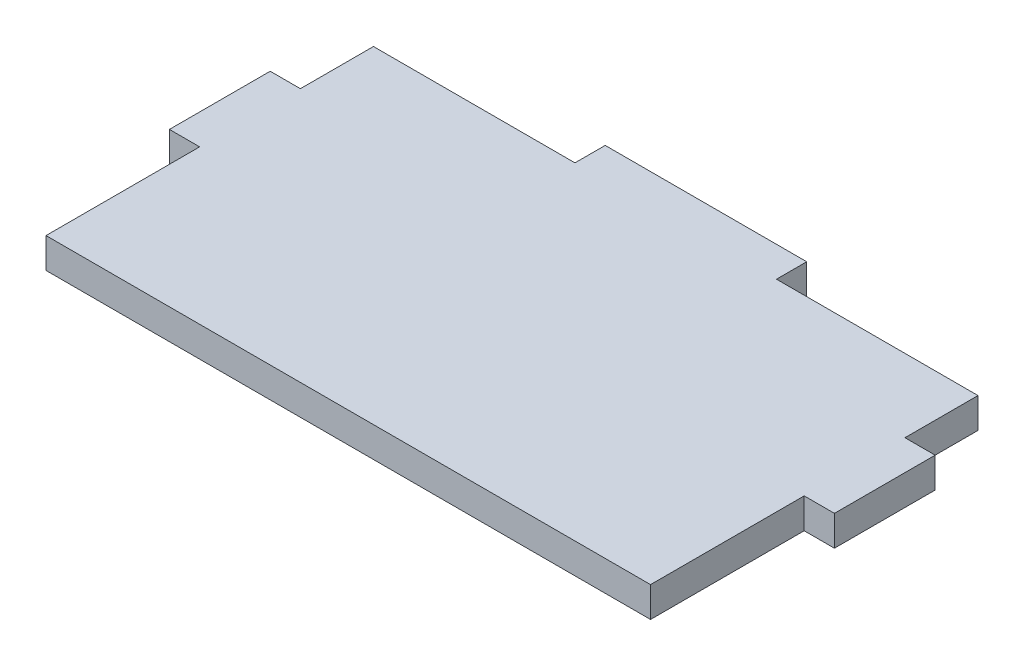
ISO-10303-21;
HEADER;
FILE_DESCRIPTION(('STEP AP214'),'2;1');
FILE_NAME('part.step','',(''),(''),'','','');
FILE_SCHEMA(('AUTOMOTIVE_DESIGN { 1 0 10303 214 1 1 1 1 }'));
ENDSEC;
DATA;
#1=APPLICATION_CONTEXT('core data for automotive mechanical design processes');
#2=APPLICATION_PROTOCOL_DEFINITION('international standard','automotive_design',2000,#1);
#3=PRODUCT_CONTEXT('',#1,'mechanical');
#4=PRODUCT('Part','Part','',(#3));
#5=PRODUCT_RELATED_PRODUCT_CATEGORY('part','',(#4));
#6=PRODUCT_DEFINITION_FORMATION('','',#4);
#7=PRODUCT_DEFINITION_CONTEXT('part definition',#1,'design');
#8=PRODUCT_DEFINITION('design','',#6,#7);
#9=PRODUCT_DEFINITION_SHAPE('','',#8);
#10=(LENGTH_UNIT() NAMED_UNIT(*) SI_UNIT(.MILLI.,.METRE.));
#11=(NAMED_UNIT(*) PLANE_ANGLE_UNIT() SI_UNIT($,.RADIAN.));
#12=(NAMED_UNIT(*) SI_UNIT($,.STERADIAN.) SOLID_ANGLE_UNIT());
#13=UNCERTAINTY_MEASURE_WITH_UNIT(LENGTH_MEASURE(1.E-05),#10,'distance_accuracy_value','');
#14=(GEOMETRIC_REPRESENTATION_CONTEXT(3) GLOBAL_UNCERTAINTY_ASSIGNED_CONTEXT((#13)) GLOBAL_UNIT_ASSIGNED_CONTEXT((#10,
#11,#12)) REPRESENTATION_CONTEXT('',''));
#15=CARTESIAN_POINT('',(0.,0.,0.));
#16=DIRECTION('',(0.,0.,1.));
#17=DIRECTION('',(1.,0.,0.));
#18=AXIS2_PLACEMENT_3D('',#15,#16,#17);
#19=CARTESIAN_POINT('',(-30.,3.,-17.75));
#20=DIRECTION('',(1.,0.,0.));
#21=DIRECTION('',(0.,0.,-1.));
#22=AXIS2_PLACEMENT_3D('',#19,#20,#21);
#23=PLANE('',#22);
#24=DIRECTION('',(0.,1.,0.));
#25=VECTOR('',#24,1.);
#26=CARTESIAN_POINT('',(-30.,0.,-14.75));
#27=LINE('',#26,#25);
#28=CARTESIAN_POINT('',(-30.,0.,-14.75));
#29=VERTEX_POINT('',#28);
#30=CARTESIAN_POINT('',(-30.,3.,-14.75));
#31=VERTEX_POINT('',#30);
#32=EDGE_CURVE('E176',#29,#31,#27,.T.);
#33=ORIENTED_EDGE('',*,*,#32,.F.);
#34=DIRECTION('',(0.,0.,1.));
#35=VECTOR('',#34,1.);
#36=CARTESIAN_POINT('',(-30.,0.,-17.75));
#37=LINE('',#36,#35);
#38=CARTESIAN_POINT('',(-30.,0.,-7.5));
#39=VERTEX_POINT('',#38);
#40=EDGE_CURVE('E169',#29,#39,#37,.T.);
#41=ORIENTED_EDGE('',*,*,#40,.T.);
#42=DIRECTION('',(0.,-1.,0.));
#43=VECTOR('',#42,1.);
#44=CARTESIAN_POINT('',(-30.,3.,-7.5));
#45=LINE('',#44,#43);
#46=CARTESIAN_POINT('',(-30.,3.,-7.5));
#47=VERTEX_POINT('',#46);
#48=EDGE_CURVE('E237',#47,#39,#45,.T.);
#49=ORIENTED_EDGE('',*,*,#48,.F.);
#50=DIRECTION('',(0.,0.,1.));
#51=VECTOR('',#50,1.);
#52=CARTESIAN_POINT('',(-30.,3.,-17.75));
#53=LINE('',#52,#51);
#54=EDGE_CURVE('E249',#31,#47,#53,.T.);
#55=ORIENTED_EDGE('',*,*,#54,.F.);
#56=EDGE_LOOP('',(#33,#41,#49,#55));
#57=FACE_BOUND('',#56,.T.);
#58=ADVANCED_FACE('F37',(#57),#23,.F.);
#59=CARTESIAN_POINT('',(-30.,3.,-17.75));
#60=DIRECTION('',(0.,0.,1.));
#61=DIRECTION('',(1.,0.,0.));
#62=AXIS2_PLACEMENT_3D('',#59,#60,#61);
#63=PLANE('',#62);
#64=DIRECTION('',(0.,1.,0.));
#65=VECTOR('',#64,1.);
#66=CARTESIAN_POINT('',(-10.,0.,-17.75));
#67=LINE('',#66,#65);
#68=CARTESIAN_POINT('',(-10.,0.,-17.75));
#69=VERTEX_POINT('',#68);
#70=CARTESIAN_POINT('',(-10.,3.,-17.75));
#71=VERTEX_POINT('',#70);
#72=EDGE_CURVE('E60',#69,#71,#67,.T.);
#73=ORIENTED_EDGE('',*,*,#72,.T.);
#74=DIRECTION('',(-1.,0.,0.));
#75=VECTOR('',#74,1.);
#76=CARTESIAN_POINT('',(-30.,3.,-17.75));
#77=LINE('',#76,#75);
#78=CARTESIAN_POINT('',(10.,3.,-17.75));
#79=VERTEX_POINT('',#78);
#80=EDGE_CURVE('E244',#79,#71,#77,.T.);
#81=ORIENTED_EDGE('',*,*,#80,.F.);
#82=DIRECTION('',(0.,1.,0.));
#83=VECTOR('',#82,1.);
#84=CARTESIAN_POINT('',(10.,0.,-17.75));
#85=LINE('',#84,#83);
#86=CARTESIAN_POINT('',(10.,0.,-17.75));
#87=VERTEX_POINT('',#86);
#88=EDGE_CURVE('E174',#87,#79,#85,.T.);
#89=ORIENTED_EDGE('',*,*,#88,.F.);
#90=DIRECTION('',(-1.,0.,0.));
#91=VECTOR('',#90,1.);
#92=CARTESIAN_POINT('',(-30.,0.,-17.75));
#93=LINE('',#92,#91);
#94=EDGE_CURVE('E256',#87,#69,#93,.T.);
#95=ORIENTED_EDGE('',*,*,#94,.T.);
#96=EDGE_LOOP('',(#73,#81,#89,#95));
#97=FACE_BOUND('',#96,.T.);
#98=ADVANCED_FACE('F303',(#97),#63,.F.);
#99=CARTESIAN_POINT('',(0.,3.,0.));
#100=DIRECTION('',(0.,1.,0.));
#101=DIRECTION('',(0.,0.,1.));
#102=AXIS2_PLACEMENT_3D('',#99,#100,#101);
#103=PLANE('',#102);
#104=DIRECTION('',(0.,0.,1.));
#105=VECTOR('',#104,1.);
#106=CARTESIAN_POINT('',(-10.,3.,0.));
#107=LINE('',#106,#105);
#108=CARTESIAN_POINT('',(-10.,3.,-14.75));
#109=VERTEX_POINT('',#108);
#110=EDGE_CURVE('E170',#71,#109,#107,.T.);
#111=ORIENTED_EDGE('',*,*,#110,.T.);
#112=DIRECTION('',(-1.,0.,0.));
#113=VECTOR('',#112,1.);
#114=CARTESIAN_POINT('',(0.,3.,-14.75));
#115=LINE('',#114,#113);
#116=EDGE_CURVE('E163',#109,#31,#115,.T.);
#117=ORIENTED_EDGE('',*,*,#116,.T.);
#118=ORIENTED_EDGE('',*,*,#54,.T.);
#119=DIRECTION('',(-1.,0.,0.));
#120=VECTOR('',#119,1.);
#121=CARTESIAN_POINT('',(-30.,3.,-7.5));
#122=LINE('',#121,#120);
#123=CARTESIAN_POINT('',(-33.,3.,-7.5));
#124=VERTEX_POINT('',#123);
#125=EDGE_CURVE('E217',#47,#124,#122,.T.);
#126=ORIENTED_EDGE('',*,*,#125,.T.);
#127=DIRECTION('',(0.,0.,1.));
#128=VECTOR('',#127,1.);
#129=CARTESIAN_POINT('',(-33.,3.,-7.5));
#130=LINE('',#129,#128);
#131=CARTESIAN_POINT('',(-33.,3.,2.5));
#132=VERTEX_POINT('',#131);
#133=EDGE_CURVE('E219',#124,#132,#130,.T.);
#134=ORIENTED_EDGE('',*,*,#133,.T.);
#135=DIRECTION('',(1.,0.,0.));
#136=VECTOR('',#135,1.);
#137=CARTESIAN_POINT('',(-33.,3.,2.5));
#138=LINE('',#137,#136);
#139=CARTESIAN_POINT('',(-30.,3.,2.5));
#140=VERTEX_POINT('',#139);
#141=EDGE_CURVE('E222',#132,#140,#138,.T.);
#142=ORIENTED_EDGE('',*,*,#141,.T.);
#143=CARTESIAN_POINT('',(-30.,3.,17.75));
#144=VERTEX_POINT('',#143);
#145=EDGE_CURVE('E248',#140,#144,#53,.T.);
#146=ORIENTED_EDGE('',*,*,#145,.T.);
#147=DIRECTION('',(1.,0.,0.));
#148=VECTOR('',#147,1.);
#149=CARTESIAN_POINT('',(-30.,3.,17.75));
#150=LINE('',#149,#148);
#151=CARTESIAN_POINT('',(30.,3.,17.75));
#152=VERTEX_POINT('',#151);
#153=EDGE_CURVE('E251',#144,#152,#150,.T.);
#154=ORIENTED_EDGE('',*,*,#153,.T.);
#155=DIRECTION('',(0.,0.,-1.));
#156=VECTOR('',#155,1.);
#157=CARTESIAN_POINT('',(30.,3.,-17.75));
#158=LINE('',#157,#156);
#159=CARTESIAN_POINT('',(30.,3.,2.5));
#160=VERTEX_POINT('',#159);
#161=EDGE_CURVE('E241',#152,#160,#158,.T.);
#162=ORIENTED_EDGE('',*,*,#161,.T.);
#163=DIRECTION('',(1.,0.,0.));
#164=VECTOR('',#163,1.);
#165=CARTESIAN_POINT('',(33.,3.,2.5));
#166=LINE('',#165,#164);
#167=CARTESIAN_POINT('',(33.,3.,2.5));
#168=VERTEX_POINT('',#167);
#169=EDGE_CURVE('E193',#160,#168,#166,.T.);
#170=ORIENTED_EDGE('',*,*,#169,.T.);
#171=DIRECTION('',(0.,0.,-1.));
#172=VECTOR('',#171,1.);
#173=CARTESIAN_POINT('',(33.,3.,-7.5));
#174=LINE('',#173,#172);
#175=CARTESIAN_POINT('',(33.,3.,-7.5));
#176=VERTEX_POINT('',#175);
#177=EDGE_CURVE('E195',#168,#176,#174,.T.);
#178=ORIENTED_EDGE('',*,*,#177,.T.);
#179=DIRECTION('',(-1.,0.,0.));
#180=VECTOR('',#179,1.);
#181=CARTESIAN_POINT('',(30.,3.,-7.5));
#182=LINE('',#181,#180);
#183=CARTESIAN_POINT('',(30.,3.,-7.5));
#184=VERTEX_POINT('',#183);
#185=EDGE_CURVE('E198',#176,#184,#182,.T.);
#186=ORIENTED_EDGE('',*,*,#185,.T.);
#187=CARTESIAN_POINT('',(30.,3.,-14.75));
#188=VERTEX_POINT('',#187);
#189=EDGE_CURVE('E245',#184,#188,#158,.T.);
#190=ORIENTED_EDGE('',*,*,#189,.T.);
#191=DIRECTION('',(1.,0.,0.));
#192=VECTOR('',#191,1.);
#193=CARTESIAN_POINT('',(0.,3.,-14.75));
#194=LINE('',#193,#192);
#195=CARTESIAN_POINT('',(10.,3.,-14.75));
#196=VERTEX_POINT('',#195);
#197=EDGE_CURVE('E183',#196,#188,#194,.T.);
#198=ORIENTED_EDGE('',*,*,#197,.F.);
#199=DIRECTION('',(0.,0.,-1.));
#200=VECTOR('',#199,1.);
#201=CARTESIAN_POINT('',(10.,3.,0.));
#202=LINE('',#201,#200);
#203=EDGE_CURVE('E186',#196,#79,#202,.T.);
#204=ORIENTED_EDGE('',*,*,#203,.T.);
#205=ORIENTED_EDGE('',*,*,#80,.T.);
#206=EDGE_LOOP('',(#111,#117,#118,#126,#134,#142,#146,#154,#162,#170,#178,#186,#190,#198,#204,#205));
#207=FACE_BOUND('',#206,.T.);
#208=ADVANCED_FACE('F278',(#207),#103,.T.);
#209=CARTESIAN_POINT('',(0.,0.,0.));
#210=DIRECTION('',(0.,1.,0.));
#211=DIRECTION('',(0.,0.,1.));
#212=AXIS2_PLACEMENT_3D('',#209,#210,#211);
#213=PLANE('',#212);
#214=DIRECTION('',(-1.,0.,0.));
#215=VECTOR('',#214,1.);
#216=CARTESIAN_POINT('',(0.,0.,-14.75));
#217=LINE('',#216,#215);
#218=CARTESIAN_POINT('',(-10.,0.,-14.75));
#219=VERTEX_POINT('',#218);
#220=EDGE_CURVE('E157',#219,#29,#217,.T.);
#221=ORIENTED_EDGE('',*,*,#220,.F.);
#222=DIRECTION('',(0.,0.,1.));
#223=VECTOR('',#222,1.);
#224=CARTESIAN_POINT('',(-10.,0.,0.));
#225=LINE('',#224,#223);
#226=EDGE_CURVE('E148',#69,#219,#225,.T.);
#227=ORIENTED_EDGE('',*,*,#226,.F.);
#228=ORIENTED_EDGE('',*,*,#94,.F.);
#229=DIRECTION('',(0.,0.,-1.));
#230=VECTOR('',#229,1.);
#231=CARTESIAN_POINT('',(10.,0.,0.));
#232=LINE('',#231,#230);
#233=CARTESIAN_POINT('',(10.,0.,-14.75));
#234=VERTEX_POINT('',#233);
#235=EDGE_CURVE('E180',#234,#87,#232,.T.);
#236=ORIENTED_EDGE('',*,*,#235,.F.);
#237=DIRECTION('',(1.,0.,0.));
#238=VECTOR('',#237,1.);
#239=CARTESIAN_POINT('',(0.,0.,-14.75));
#240=LINE('',#239,#238);
#241=CARTESIAN_POINT('',(30.,0.,-14.75));
#242=VERTEX_POINT('',#241);
#243=EDGE_CURVE('E182',#234,#242,#240,.T.);
#244=ORIENTED_EDGE('',*,*,#243,.T.);
#245=DIRECTION('',(0.,0.,-1.));
#246=VECTOR('',#245,1.);
#247=CARTESIAN_POINT('',(30.,0.,-17.75));
#248=LINE('',#247,#246);
#249=CARTESIAN_POINT('',(30.,0.,-7.5));
#250=VERTEX_POINT('',#249);
#251=EDGE_CURVE('E240',#250,#242,#248,.T.);
#252=ORIENTED_EDGE('',*,*,#251,.F.);
#253=DIRECTION('',(-1.,0.,0.));
#254=VECTOR('',#253,1.);
#255=CARTESIAN_POINT('',(30.,0.,-7.5));
#256=LINE('',#255,#254);
#257=CARTESIAN_POINT('',(33.,0.,-7.5));
#258=VERTEX_POINT('',#257);
#259=EDGE_CURVE('E196',#258,#250,#256,.T.);
#260=ORIENTED_EDGE('',*,*,#259,.F.);
#261=DIRECTION('',(0.,0.,-1.));
#262=VECTOR('',#261,1.);
#263=CARTESIAN_POINT('',(33.,0.,-7.5));
#264=LINE('',#263,#262);
#265=CARTESIAN_POINT('',(33.,0.,2.5));
#266=VERTEX_POINT('',#265);
#267=EDGE_CURVE('E202',#266,#258,#264,.T.);
#268=ORIENTED_EDGE('',*,*,#267,.F.);
#269=DIRECTION('',(1.,0.,0.));
#270=VECTOR('',#269,1.);
#271=CARTESIAN_POINT('',(33.,0.,2.5));
#272=LINE('',#271,#270);
#273=CARTESIAN_POINT('',(30.,0.,2.5));
#274=VERTEX_POINT('',#273);
#275=EDGE_CURVE('E178',#274,#266,#272,.T.);
#276=ORIENTED_EDGE('',*,*,#275,.F.);
#277=CARTESIAN_POINT('',(30.,0.,17.75));
#278=VERTEX_POINT('',#277);
#279=EDGE_CURVE('E253',#278,#274,#248,.T.);
#280=ORIENTED_EDGE('',*,*,#279,.F.);
#281=DIRECTION('',(1.,0.,0.));
#282=VECTOR('',#281,1.);
#283=CARTESIAN_POINT('',(-30.,0.,17.75));
#284=LINE('',#283,#282);
#285=CARTESIAN_POINT('',(-30.,0.,17.75));
#286=VERTEX_POINT('',#285);
#287=EDGE_CURVE('E260',#286,#278,#284,.T.);
#288=ORIENTED_EDGE('',*,*,#287,.F.);
#289=CARTESIAN_POINT('',(-30.,0.,2.5));
#290=VERTEX_POINT('',#289);
#291=EDGE_CURVE('E258',#290,#286,#37,.T.);
#292=ORIENTED_EDGE('',*,*,#291,.F.);
#293=DIRECTION('',(1.,0.,0.));
#294=VECTOR('',#293,1.);
#295=CARTESIAN_POINT('',(-33.,0.,2.5));
#296=LINE('',#295,#294);
#297=CARTESIAN_POINT('',(-33.,0.,2.5));
#298=VERTEX_POINT('',#297);
#299=EDGE_CURVE('E220',#298,#290,#296,.T.);
#300=ORIENTED_EDGE('',*,*,#299,.F.);
#301=DIRECTION('',(0.,0.,1.));
#302=VECTOR('',#301,1.);
#303=CARTESIAN_POINT('',(-33.,0.,-7.5));
#304=LINE('',#303,#302);
#305=CARTESIAN_POINT('',(-33.,0.,-7.5));
#306=VERTEX_POINT('',#305);
#307=EDGE_CURVE('E226',#306,#298,#304,.T.);
#308=ORIENTED_EDGE('',*,*,#307,.F.);
#309=DIRECTION('',(-1.,0.,0.));
#310=VECTOR('',#309,1.);
#311=CARTESIAN_POINT('',(-30.,0.,-7.5));
#312=LINE('',#311,#310);
#313=EDGE_CURVE('E216',#39,#306,#312,.T.);
#314=ORIENTED_EDGE('',*,*,#313,.F.);
#315=ORIENTED_EDGE('',*,*,#40,.F.);
#316=EDGE_LOOP('',(#221,#227,#228,#236,#244,#252,#260,#268,#276,#280,#288,#292,#300,#308,#314,#315));
#317=FACE_BOUND('',#316,.T.);
#318=ADVANCED_FACE('F167',(#317),#213,.F.);
#319=CARTESIAN_POINT('',(30.,3.,-17.75));
#320=DIRECTION('',(-1.,0.,0.));
#321=DIRECTION('',(0.,0.,1.));
#322=AXIS2_PLACEMENT_3D('',#319,#320,#321);
#323=PLANE('',#322);
#324=DIRECTION('',(0.,-1.,0.));
#325=VECTOR('',#324,1.);
#326=CARTESIAN_POINT('',(30.,3.,2.5));
#327=LINE('',#326,#325);
#328=EDGE_CURVE('E213',#160,#274,#327,.T.);
#329=ORIENTED_EDGE('',*,*,#328,.F.);
#330=ORIENTED_EDGE('',*,*,#161,.F.);
#331=DIRECTION('',(0.,-1.,0.));
#332=VECTOR('',#331,1.);
#333=CARTESIAN_POINT('',(30.,3.,17.75));
#334=LINE('',#333,#332);
#335=EDGE_CURVE('E45',#152,#278,#334,.T.);
#336=ORIENTED_EDGE('',*,*,#335,.T.);
#337=ORIENTED_EDGE('',*,*,#279,.T.);
#338=EDGE_LOOP('',(#329,#330,#336,#337));
#339=FACE_BOUND('',#338,.T.);
#340=ADVANCED_FACE('F267',(#339),#323,.F.);
#341=ORIENTED_EDGE('',*,*,#251,.T.);
#342=DIRECTION('',(0.,1.,0.));
#343=VECTOR('',#342,1.);
#344=CARTESIAN_POINT('',(30.,0.,-14.75));
#345=LINE('',#344,#343);
#346=EDGE_CURVE('E52',#242,#188,#345,.T.);
#347=ORIENTED_EDGE('',*,*,#346,.T.);
#348=ORIENTED_EDGE('',*,*,#189,.F.);
#349=DIRECTION('',(0.,-1.,0.));
#350=VECTOR('',#349,1.);
#351=CARTESIAN_POINT('',(30.,3.,-7.5));
#352=LINE('',#351,#350);
#353=EDGE_CURVE('E200',#184,#250,#352,.T.);
#354=ORIENTED_EDGE('',*,*,#353,.T.);
#355=EDGE_LOOP('',(#341,#347,#348,#354));
#356=FACE_BOUND('',#355,.T.);
#357=ADVANCED_FACE('F39',(#356),#323,.F.);
#358=ORIENTED_EDGE('',*,*,#145,.F.);
#359=DIRECTION('',(0.,-1.,0.));
#360=VECTOR('',#359,1.);
#361=CARTESIAN_POINT('',(-30.,3.,2.5));
#362=LINE('',#361,#360);
#363=EDGE_CURVE('E224',#140,#290,#362,.T.);
#364=ORIENTED_EDGE('',*,*,#363,.T.);
#365=ORIENTED_EDGE('',*,*,#291,.T.);
#366=DIRECTION('',(0.,-1.,0.));
#367=VECTOR('',#366,1.);
#368=CARTESIAN_POINT('',(-30.,3.,17.75));
#369=LINE('',#368,#367);
#370=EDGE_CURVE('E11',#144,#286,#369,.T.);
#371=ORIENTED_EDGE('',*,*,#370,.F.);
#372=EDGE_LOOP('',(#358,#364,#365,#371));
#373=FACE_BOUND('',#372,.T.);
#374=ADVANCED_FACE('F283',(#373),#23,.F.);
#375=CARTESIAN_POINT('',(-30.,3.,17.75));
#376=DIRECTION('',(0.,0.,-1.));
#377=DIRECTION('',(-1.,0.,0.));
#378=AXIS2_PLACEMENT_3D('',#375,#376,#377);
#379=PLANE('',#378);
#380=ORIENTED_EDGE('',*,*,#287,.T.);
#381=ORIENTED_EDGE('',*,*,#335,.F.);
#382=ORIENTED_EDGE('',*,*,#153,.F.);
#383=ORIENTED_EDGE('',*,*,#370,.T.);
#384=EDGE_LOOP('',(#380,#381,#382,#383));
#385=FACE_BOUND('',#384,.T.);
#386=ADVANCED_FACE('F281',(#385),#379,.F.);
#387=CARTESIAN_POINT('',(-30.,3.,-7.5));
#388=DIRECTION('',(0.,0.,1.));
#389=DIRECTION('',(1.,0.,0.));
#390=AXIS2_PLACEMENT_3D('',#387,#388,#389);
#391=PLANE('',#390);
#392=ORIENTED_EDGE('',*,*,#313,.T.);
#393=DIRECTION('',(0.,-1.,0.));
#394=VECTOR('',#393,1.);
#395=CARTESIAN_POINT('',(-33.,3.,-7.5));
#396=LINE('',#395,#394);
#397=EDGE_CURVE('E234',#124,#306,#396,.T.);
#398=ORIENTED_EDGE('',*,*,#397,.F.);
#399=ORIENTED_EDGE('',*,*,#125,.F.);
#400=ORIENTED_EDGE('',*,*,#48,.T.);
#401=EDGE_LOOP('',(#392,#398,#399,#400));
#402=FACE_BOUND('',#401,.T.);
#403=ADVANCED_FACE('F297',(#402),#391,.F.);
#404=CARTESIAN_POINT('',(-33.,3.,-7.5));
#405=DIRECTION('',(1.,0.,0.));
#406=DIRECTION('',(0.,0.,-1.));
#407=AXIS2_PLACEMENT_3D('',#404,#405,#406);
#408=PLANE('',#407);
#409=ORIENTED_EDGE('',*,*,#307,.T.);
#410=DIRECTION('',(0.,-1.,0.));
#411=VECTOR('',#410,1.);
#412=CARTESIAN_POINT('',(-33.,3.,2.5));
#413=LINE('',#412,#411);
#414=EDGE_CURVE('E231',#132,#298,#413,.T.);
#415=ORIENTED_EDGE('',*,*,#414,.F.);
#416=ORIENTED_EDGE('',*,*,#133,.F.);
#417=ORIENTED_EDGE('',*,*,#397,.T.);
#418=EDGE_LOOP('',(#409,#415,#416,#417));
#419=FACE_BOUND('',#418,.T.);
#420=ADVANCED_FACE('F293',(#419),#408,.F.);
#421=CARTESIAN_POINT('',(-33.,3.,2.5));
#422=DIRECTION('',(0.,0.,-1.));
#423=DIRECTION('',(-1.,0.,0.));
#424=AXIS2_PLACEMENT_3D('',#421,#422,#423);
#425=PLANE('',#424);
#426=ORIENTED_EDGE('',*,*,#299,.T.);
#427=ORIENTED_EDGE('',*,*,#363,.F.);
#428=ORIENTED_EDGE('',*,*,#141,.F.);
#429=ORIENTED_EDGE('',*,*,#414,.T.);
#430=EDGE_LOOP('',(#426,#427,#428,#429));
#431=FACE_BOUND('',#430,.T.);
#432=ADVANCED_FACE('F288',(#431),#425,.F.);
#433=CARTESIAN_POINT('',(33.,3.,2.5));
#434=DIRECTION('',(0.,0.,-1.));
#435=DIRECTION('',(-1.,0.,0.));
#436=AXIS2_PLACEMENT_3D('',#433,#434,#435);
#437=PLANE('',#436);
#438=ORIENTED_EDGE('',*,*,#275,.T.);
#439=DIRECTION('',(0.,-1.,0.));
#440=VECTOR('',#439,1.);
#441=CARTESIAN_POINT('',(33.,3.,2.5));
#442=LINE('',#441,#440);
#443=EDGE_CURVE('E210',#168,#266,#442,.T.);
#444=ORIENTED_EDGE('',*,*,#443,.F.);
#445=ORIENTED_EDGE('',*,*,#169,.F.);
#446=ORIENTED_EDGE('',*,*,#328,.T.);
#447=EDGE_LOOP('',(#438,#444,#445,#446));
#448=FACE_BOUND('',#447,.T.);
#449=ADVANCED_FACE('F276',(#448),#437,.F.);
#450=CARTESIAN_POINT('',(33.,3.,-7.5));
#451=DIRECTION('',(-1.,0.,0.));
#452=DIRECTION('',(0.,0.,1.));
#453=AXIS2_PLACEMENT_3D('',#450,#451,#452);
#454=PLANE('',#453);
#455=ORIENTED_EDGE('',*,*,#267,.T.);
#456=DIRECTION('',(0.,-1.,0.));
#457=VECTOR('',#456,1.);
#458=CARTESIAN_POINT('',(33.,3.,-7.5));
#459=LINE('',#458,#457);
#460=EDGE_CURVE('E207',#176,#258,#459,.T.);
#461=ORIENTED_EDGE('',*,*,#460,.F.);
#462=ORIENTED_EDGE('',*,*,#177,.F.);
#463=ORIENTED_EDGE('',*,*,#443,.T.);
#464=EDGE_LOOP('',(#455,#461,#462,#463));
#465=FACE_BOUND('',#464,.T.);
#466=ADVANCED_FACE('F345',(#465),#454,.F.);
#467=CARTESIAN_POINT('',(30.,3.,-7.5));
#468=DIRECTION('',(0.,0.,1.));
#469=DIRECTION('',(1.,0.,0.));
#470=AXIS2_PLACEMENT_3D('',#467,#468,#469);
#471=PLANE('',#470);
#472=ORIENTED_EDGE('',*,*,#259,.T.);
#473=ORIENTED_EDGE('',*,*,#353,.F.);
#474=ORIENTED_EDGE('',*,*,#185,.F.);
#475=ORIENTED_EDGE('',*,*,#460,.T.);
#476=EDGE_LOOP('',(#472,#473,#474,#475));
#477=FACE_BOUND('',#476,.T.);
#478=ADVANCED_FACE('F320',(#477),#471,.F.);
#479=CARTESIAN_POINT('',(10.,0.,0.));
#480=DIRECTION('',(1.,0.,0.));
#481=DIRECTION('',(0.,0.,-1.));
#482=AXIS2_PLACEMENT_3D('',#479,#480,#481);
#483=PLANE('',#482);
#484=ORIENTED_EDGE('',*,*,#203,.F.);
#485=DIRECTION('',(0.,1.,0.));
#486=VECTOR('',#485,1.);
#487=CARTESIAN_POINT('',(10.,0.,-14.75));
#488=LINE('',#487,#486);
#489=EDGE_CURVE('E185',#234,#196,#488,.T.);
#490=ORIENTED_EDGE('',*,*,#489,.F.);
#491=ORIENTED_EDGE('',*,*,#235,.T.);
#492=ORIENTED_EDGE('',*,*,#88,.T.);
#493=EDGE_LOOP('',(#484,#490,#491,#492));
#494=FACE_BOUND('',#493,.T.);
#495=ADVANCED_FACE('F310',(#494),#483,.T.);
#496=CARTESIAN_POINT('',(0.,0.,-14.75));
#497=DIRECTION('',(0.,0.,1.));
#498=DIRECTION('',(1.,0.,0.));
#499=AXIS2_PLACEMENT_3D('',#496,#497,#498);
#500=PLANE('',#499);
#501=ORIENTED_EDGE('',*,*,#197,.T.);
#502=ORIENTED_EDGE('',*,*,#346,.F.);
#503=ORIENTED_EDGE('',*,*,#243,.F.);
#504=ORIENTED_EDGE('',*,*,#489,.T.);
#505=EDGE_LOOP('',(#501,#502,#503,#504));
#506=FACE_BOUND('',#505,.T.);
#507=ADVANCED_FACE('F312',(#506),#500,.F.);
#508=CARTESIAN_POINT('',(0.,0.,-14.75));
#509=DIRECTION('',(0.,0.,-1.));
#510=DIRECTION('',(-1.,0.,0.));
#511=AXIS2_PLACEMENT_3D('',#508,#509,#510);
#512=PLANE('',#511);
#513=ORIENTED_EDGE('',*,*,#116,.F.);
#514=DIRECTION('',(0.,1.,0.));
#515=VECTOR('',#514,1.);
#516=CARTESIAN_POINT('',(-10.,0.,-14.75));
#517=LINE('',#516,#515);
#518=EDGE_CURVE('E151',#219,#109,#517,.T.);
#519=ORIENTED_EDGE('',*,*,#518,.F.);
#520=ORIENTED_EDGE('',*,*,#220,.T.);
#521=ORIENTED_EDGE('',*,*,#32,.T.);
#522=EDGE_LOOP('',(#513,#519,#520,#521));
#523=FACE_BOUND('',#522,.T.);
#524=ADVANCED_FACE('F160',(#523),#512,.T.);
#525=CARTESIAN_POINT('',(-10.,0.,0.));
#526=DIRECTION('',(-1.,0.,0.));
#527=DIRECTION('',(0.,0.,1.));
#528=AXIS2_PLACEMENT_3D('',#525,#526,#527);
#529=PLANE('',#528);
#530=ORIENTED_EDGE('',*,*,#110,.F.);
#531=ORIENTED_EDGE('',*,*,#72,.F.);
#532=ORIENTED_EDGE('',*,*,#226,.T.);
#533=ORIENTED_EDGE('',*,*,#518,.T.);
#534=EDGE_LOOP('',(#530,#531,#532,#533));
#535=FACE_BOUND('',#534,.T.);
#536=ADVANCED_FACE('F150',(#535),#529,.T.);
#537=CLOSED_SHELL('',(#58,#98,#208,#318,#340,#357,#374,#386,#403,#420,#432,#449,#466,#478,#495,
#507,#524,#536));
#538=MANIFOLD_SOLID_BREP('B2',#537);
#539=ADVANCED_BREP_SHAPE_REPRESENTATION('',(#18,#538),#14);
#540=SHAPE_DEFINITION_REPRESENTATION(#9,#539);
ENDSEC;
END-ISO-10303-21;
